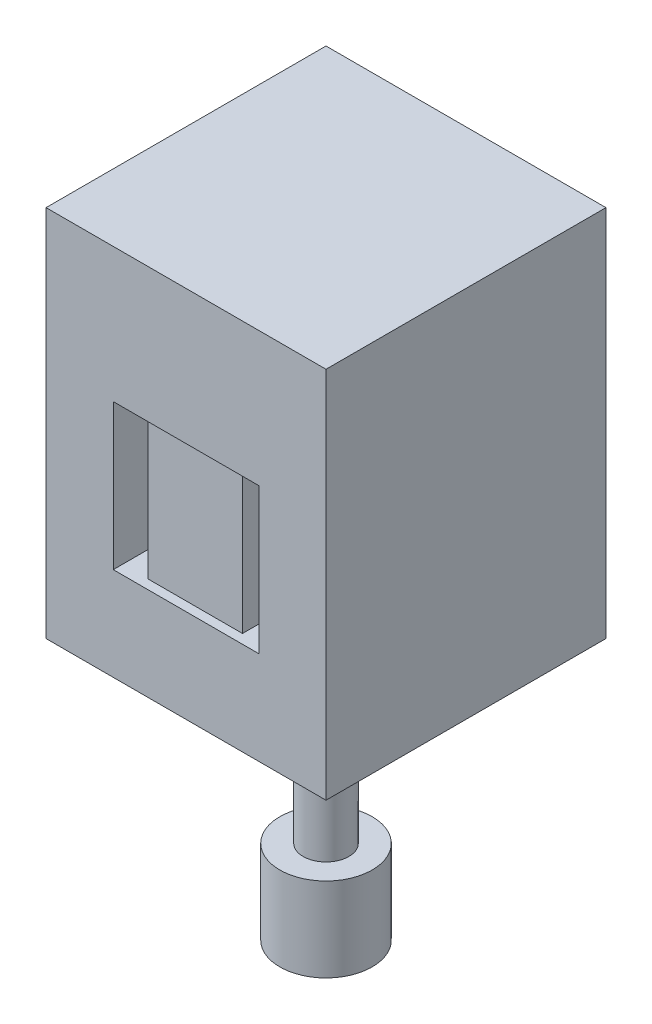
ISO-10303-21;
HEADER;
FILE_DESCRIPTION(('STEP AP214'),'2;1');
FILE_NAME('part.step','',(''),(''),'','','');
FILE_SCHEMA(('AUTOMOTIVE_DESIGN { 1 0 10303 214 1 1 1 1 }'));
ENDSEC;
DATA;
#1=APPLICATION_CONTEXT('core data for automotive mechanical design processes');
#2=APPLICATION_PROTOCOL_DEFINITION('international standard','automotive_design',2000,#1);
#3=PRODUCT_CONTEXT('',#1,'mechanical');
#4=PRODUCT('Part','Part','',(#3));
#5=PRODUCT_RELATED_PRODUCT_CATEGORY('part','',(#4));
#6=PRODUCT_DEFINITION_FORMATION('','',#4);
#7=PRODUCT_DEFINITION_CONTEXT('part definition',#1,'design');
#8=PRODUCT_DEFINITION('design','',#6,#7);
#9=PRODUCT_DEFINITION_SHAPE('','',#8);
#10=(LENGTH_UNIT() NAMED_UNIT(*) SI_UNIT(.MILLI.,.METRE.));
#11=(NAMED_UNIT(*) PLANE_ANGLE_UNIT() SI_UNIT($,.RADIAN.));
#12=(NAMED_UNIT(*) SI_UNIT($,.STERADIAN.) SOLID_ANGLE_UNIT());
#13=UNCERTAINTY_MEASURE_WITH_UNIT(LENGTH_MEASURE(1.E-05),#10,'distance_accuracy_value','');
#14=(GEOMETRIC_REPRESENTATION_CONTEXT(3) GLOBAL_UNCERTAINTY_ASSIGNED_CONTEXT((#13)) GLOBAL_UNIT_ASSIGNED_CONTEXT((#10,
#11,#12)) REPRESENTATION_CONTEXT('',''));
#15=CARTESIAN_POINT('',(0.,0.,0.));
#16=DIRECTION('',(0.,0.,1.));
#17=DIRECTION('',(1.,0.,0.));
#18=AXIS2_PLACEMENT_3D('',#15,#16,#17);
#19=CARTESIAN_POINT('',(0.,0.,14.));
#20=DIRECTION('',(0.,0.,-1.));
#21=DIRECTION('',(-1.,0.,0.));
#22=AXIS2_PLACEMENT_3D('',#19,#20,#21);
#23=PLANE('',#22);
#24=DIRECTION('',(0.,1.,0.));
#25=VECTOR('',#24,1.);
#26=CARTESIAN_POINT('',(-5.05,25.6,14.));
#27=LINE('',#26,#25);
#28=CARTESIAN_POINT('',(-5.05,10.,14.));
#29=VERTEX_POINT('',#28);
#30=CARTESIAN_POINT('',(-5.05,25.6,14.));
#31=VERTEX_POINT('',#30);
#32=EDGE_CURVE('E165',#29,#31,#27,.T.);
#33=ORIENTED_EDGE('',*,*,#32,.F.);
#34=DIRECTION('',(1.,0.,0.));
#35=VECTOR('',#34,1.);
#36=CARTESIAN_POINT('',(-7.8,10.,14.));
#37=LINE('',#36,#35);
#38=CARTESIAN_POINT('',(5.05,10.,14.));
#39=VERTEX_POINT('',#38);
#40=EDGE_CURVE('E208',#29,#39,#37,.T.);
#41=ORIENTED_EDGE('',*,*,#40,.T.);
#42=DIRECTION('',(0.,-1.,0.));
#43=VECTOR('',#42,1.);
#44=CARTESIAN_POINT('',(5.05,25.6,14.));
#45=LINE('',#44,#43);
#46=CARTESIAN_POINT('',(5.05,25.6,14.));
#47=VERTEX_POINT('',#46);
#48=EDGE_CURVE('E168',#47,#39,#45,.T.);
#49=ORIENTED_EDGE('',*,*,#48,.F.);
#50=DIRECTION('',(-1.,0.,0.));
#51=VECTOR('',#50,1.);
#52=CARTESIAN_POINT('',(-7.8,25.6,14.));
#53=LINE('',#52,#51);
#54=EDGE_CURVE('E204',#47,#31,#53,.T.);
#55=ORIENTED_EDGE('',*,*,#54,.T.);
#56=EDGE_LOOP('',(#33,#41,#49,#55));
#57=FACE_BOUND('',#56,.T.);
#58=ADVANCED_FACE('F45',(#57),#23,.F.);
#59=CARTESIAN_POINT('',(15.,40.,15.));
#60=DIRECTION('',(-1.,0.,0.));
#61=DIRECTION('',(0.,0.,1.));
#62=AXIS2_PLACEMENT_3D('',#59,#60,#61);
#63=PLANE('',#62);
#64=DIRECTION('',(0.,0.,-1.));
#65=VECTOR('',#64,1.);
#66=CARTESIAN_POINT('',(15.,0.,15.));
#67=LINE('',#66,#65);
#68=CARTESIAN_POINT('',(15.,0.,15.));
#69=VERTEX_POINT('',#68);
#70=CARTESIAN_POINT('',(15.,0.,-15.));
#71=VERTEX_POINT('',#70);
#72=EDGE_CURVE('E243',#69,#71,#67,.T.);
#73=ORIENTED_EDGE('',*,*,#72,.T.);
#74=DIRECTION('',(0.,-1.,0.));
#75=VECTOR('',#74,1.);
#76=CARTESIAN_POINT('',(15.,40.,-15.));
#77=LINE('',#76,#75);
#78=CARTESIAN_POINT('',(15.,40.,-15.));
#79=VERTEX_POINT('',#78);
#80=EDGE_CURVE('E281',#79,#71,#77,.T.);
#81=ORIENTED_EDGE('',*,*,#80,.F.);
#82=DIRECTION('',(0.,0.,-1.));
#83=VECTOR('',#82,1.);
#84=CARTESIAN_POINT('',(15.,40.,15.));
#85=LINE('',#84,#83);
#86=CARTESIAN_POINT('',(15.,40.,15.));
#87=VERTEX_POINT('',#86);
#88=EDGE_CURVE('E244',#87,#79,#85,.T.);
#89=ORIENTED_EDGE('',*,*,#88,.F.);
#90=DIRECTION('',(0.,-1.,0.));
#91=VECTOR('',#90,1.);
#92=CARTESIAN_POINT('',(15.,40.,15.));
#93=LINE('',#92,#91);
#94=EDGE_CURVE('E258',#87,#69,#93,.T.);
#95=ORIENTED_EDGE('',*,*,#94,.T.);
#96=EDGE_LOOP('',(#73,#81,#89,#95));
#97=FACE_BOUND('',#96,.T.);
#98=ADVANCED_FACE('F301',(#97),#63,.F.);
#99=CARTESIAN_POINT('',(-15.,40.,-15.));
#100=DIRECTION('',(0.,0.,1.));
#101=DIRECTION('',(1.,0.,0.));
#102=AXIS2_PLACEMENT_3D('',#99,#100,#101);
#103=PLANE('',#102);
#104=DIRECTION('',(-1.,0.,0.));
#105=VECTOR('',#104,1.);
#106=CARTESIAN_POINT('',(-15.,0.,-15.));
#107=LINE('',#106,#105);
#108=CARTESIAN_POINT('',(-15.,0.,-15.));
#109=VERTEX_POINT('',#108);
#110=EDGE_CURVE('E262',#71,#109,#107,.T.);
#111=ORIENTED_EDGE('',*,*,#110,.T.);
#112=DIRECTION('',(0.,-1.,0.));
#113=VECTOR('',#112,1.);
#114=CARTESIAN_POINT('',(-15.,40.,-15.));
#115=LINE('',#114,#113);
#116=CARTESIAN_POINT('',(-15.,40.,-15.));
#117=VERTEX_POINT('',#116);
#118=EDGE_CURVE('E277',#117,#109,#115,.T.);
#119=ORIENTED_EDGE('',*,*,#118,.F.);
#120=DIRECTION('',(-1.,0.,0.));
#121=VECTOR('',#120,1.);
#122=CARTESIAN_POINT('',(-15.,40.,-15.));
#123=LINE('',#122,#121);
#124=EDGE_CURVE('E248',#79,#117,#123,.T.);
#125=ORIENTED_EDGE('',*,*,#124,.F.);
#126=ORIENTED_EDGE('',*,*,#80,.T.);
#127=EDGE_LOOP('',(#111,#119,#125,#126));
#128=FACE_BOUND('',#127,.T.);
#129=ADVANCED_FACE('F309',(#128),#103,.F.);
#130=CARTESIAN_POINT('',(-15.,40.,15.));
#131=DIRECTION('',(1.,0.,0.));
#132=DIRECTION('',(0.,0.,-1.));
#133=AXIS2_PLACEMENT_3D('',#130,#131,#132);
#134=PLANE('',#133);
#135=DIRECTION('',(0.,0.,1.));
#136=VECTOR('',#135,1.);
#137=CARTESIAN_POINT('',(-15.,0.,15.));
#138=LINE('',#137,#136);
#139=CARTESIAN_POINT('',(-15.,0.,15.));
#140=VERTEX_POINT('',#139);
#141=EDGE_CURVE('E265',#109,#140,#138,.T.);
#142=ORIENTED_EDGE('',*,*,#141,.T.);
#143=DIRECTION('',(0.,-1.,0.));
#144=VECTOR('',#143,1.);
#145=CARTESIAN_POINT('',(-15.,40.,15.));
#146=LINE('',#145,#144);
#147=CARTESIAN_POINT('',(-15.,40.,15.));
#148=VERTEX_POINT('',#147);
#149=EDGE_CURVE('E273',#148,#140,#146,.T.);
#150=ORIENTED_EDGE('',*,*,#149,.F.);
#151=DIRECTION('',(0.,0.,1.));
#152=VECTOR('',#151,1.);
#153=CARTESIAN_POINT('',(-15.,40.,15.));
#154=LINE('',#153,#152);
#155=EDGE_CURVE('E252',#117,#148,#154,.T.);
#156=ORIENTED_EDGE('',*,*,#155,.F.);
#157=ORIENTED_EDGE('',*,*,#118,.T.);
#158=EDGE_LOOP('',(#142,#150,#156,#157));
#159=FACE_BOUND('',#158,.T.);
#160=ADVANCED_FACE('F350',(#159),#134,.F.);
#161=CARTESIAN_POINT('',(-15.,40.,15.));
#162=DIRECTION('',(0.,0.,-1.));
#163=DIRECTION('',(-1.,0.,0.));
#164=AXIS2_PLACEMENT_3D('',#161,#162,#163);
#165=PLANE('',#164);
#166=DIRECTION('',(-1.,0.,0.));
#167=VECTOR('',#166,1.);
#168=CARTESIAN_POINT('',(-7.8,25.6,15.));
#169=LINE('',#168,#167);
#170=CARTESIAN_POINT('',(7.79999999999999,25.6,15.));
#171=VERTEX_POINT('',#170);
#172=CARTESIAN_POINT('',(-7.8,25.6,15.));
#173=VERTEX_POINT('',#172);
#174=EDGE_CURVE('E216',#171,#173,#169,.T.);
#175=ORIENTED_EDGE('',*,*,#174,.F.);
#176=DIRECTION('',(0.,1.,0.));
#177=VECTOR('',#176,1.);
#178=CARTESIAN_POINT('',(7.79999999999999,10.,15.));
#179=LINE('',#178,#177);
#180=CARTESIAN_POINT('',(7.79999999999999,10.,15.));
#181=VERTEX_POINT('',#180);
#182=EDGE_CURVE('E178',#181,#171,#179,.T.);
#183=ORIENTED_EDGE('',*,*,#182,.F.);
#184=DIRECTION('',(1.,0.,0.));
#185=VECTOR('',#184,1.);
#186=CARTESIAN_POINT('',(-7.8,10.,15.));
#187=LINE('',#186,#185);
#188=CARTESIAN_POINT('',(-7.8,10.,15.));
#189=VERTEX_POINT('',#188);
#190=EDGE_CURVE('E209',#189,#181,#187,.T.);
#191=ORIENTED_EDGE('',*,*,#190,.F.);
#192=DIRECTION('',(0.,-1.,0.));
#193=VECTOR('',#192,1.);
#194=CARTESIAN_POINT('',(-7.8,10.,15.));
#195=LINE('',#194,#193);
#196=EDGE_CURVE('E144',#173,#189,#195,.T.);
#197=ORIENTED_EDGE('',*,*,#196,.F.);
#198=EDGE_LOOP('',(#175,#183,#191,#197));
#199=FACE_BOUND('',#198,.T.);
#200=DIRECTION('',(1.,0.,0.));
#201=VECTOR('',#200,1.);
#202=CARTESIAN_POINT('',(-15.,0.,15.));
#203=LINE('',#202,#201);
#204=EDGE_CURVE('E249',#140,#69,#203,.T.);
#205=ORIENTED_EDGE('',*,*,#204,.T.);
#206=ORIENTED_EDGE('',*,*,#94,.F.);
#207=DIRECTION('',(1.,0.,0.));
#208=VECTOR('',#207,1.);
#209=CARTESIAN_POINT('',(-15.,40.,15.));
#210=LINE('',#209,#208);
#211=EDGE_CURVE('E255',#148,#87,#210,.T.);
#212=ORIENTED_EDGE('',*,*,#211,.F.);
#213=ORIENTED_EDGE('',*,*,#149,.T.);
#214=EDGE_LOOP('',(#205,#206,#212,#213));
#215=FACE_BOUND('',#214,.T.);
#216=ADVANCED_FACE('F344',(#199,#215),#165,.F.);
#217=CARTESIAN_POINT('',(0.,40.,0.));
#218=DIRECTION('',(0.,-1.,0.));
#219=DIRECTION('',(0.,0.,-1.));
#220=AXIS2_PLACEMENT_3D('',#217,#218,#219);
#221=PLANE('',#220);
#222=ORIENTED_EDGE('',*,*,#88,.T.);
#223=ORIENTED_EDGE('',*,*,#124,.T.);
#224=ORIENTED_EDGE('',*,*,#155,.T.);
#225=ORIENTED_EDGE('',*,*,#211,.T.);
#226=EDGE_LOOP('',(#222,#223,#224,#225));
#227=FACE_BOUND('',#226,.T.);
#228=ADVANCED_FACE('F341',(#227),#221,.F.);
#229=CARTESIAN_POINT('',(0.,0.,0.));
#230=DIRECTION('',(0.,-1.,0.));
#231=DIRECTION('',(0.,0.,-1.));
#232=AXIS2_PLACEMENT_3D('',#229,#230,#231);
#233=PLANE('',#232);
#234=CARTESIAN_POINT('',(0.,0.,0.));
#235=DIRECTION('',(0.,-1.,0.));
#236=DIRECTION('',(0.,0.,-1.));
#237=AXIS2_PLACEMENT_3D('',#234,#235,#236);
#238=CIRCLE('',#237,5.45);
#239=CARTESIAN_POINT('',(0.,0.,-5.45));
#240=VERTEX_POINT('',#239);
#241=EDGE_CURVE('E11',#240,#240,#238,.F.);
#242=ORIENTED_EDGE('',*,*,#241,.T.);
#243=EDGE_LOOP('',(#242));
#244=FACE_BOUND('',#243,.T.);
#245=ORIENTED_EDGE('',*,*,#72,.F.);
#246=ORIENTED_EDGE('',*,*,#204,.F.);
#247=ORIENTED_EDGE('',*,*,#141,.F.);
#248=ORIENTED_EDGE('',*,*,#110,.F.);
#249=EDGE_LOOP('',(#245,#246,#247,#248));
#250=FACE_BOUND('',#249,.T.);
#251=ADVANCED_FACE('F340',(#244,#250),#233,.T.);
#252=CARTESIAN_POINT('',(0.,-19.,0.));
#253=DIRECTION('',(0.,1.,0.));
#254=DIRECTION('',(0.,0.,1.));
#255=AXIS2_PLACEMENT_3D('',#252,#253,#254);
#256=CYLINDRICAL_SURFACE('',#255,2.45);
#257=CARTESIAN_POINT('',(0.,-3.,0.));
#258=DIRECTION('',(0.,-1.,0.));
#259=DIRECTION('',(0.,0.,-1.));
#260=AXIS2_PLACEMENT_3D('',#257,#258,#259);
#261=CIRCLE('',#260,2.45);
#262=CARTESIAN_POINT('',(0.,-3.,-2.45));
#263=VERTEX_POINT('',#262);
#264=EDGE_CURVE('E54',#263,#263,#261,.T.);
#265=ORIENTED_EDGE('',*,*,#264,.T.);
#266=EDGE_LOOP('',(#265));
#267=FACE_BOUND('',#266,.T.);
#268=CARTESIAN_POINT('',(0.,-19.,0.));
#269=DIRECTION('',(0.,-1.,0.));
#270=DIRECTION('',(0.,0.,-1.));
#271=AXIS2_PLACEMENT_3D('',#268,#269,#270);
#272=CIRCLE('',#271,2.45);
#273=CARTESIAN_POINT('',(0.,-19.,-2.45));
#274=VERTEX_POINT('',#273);
#275=EDGE_CURVE('E236',#274,#274,#272,.T.);
#276=ORIENTED_EDGE('',*,*,#275,.F.);
#277=EDGE_LOOP('',(#276));
#278=FACE_BOUND('',#277,.T.);
#279=ADVANCED_FACE('F288',(#267,#278),#256,.T.);
#280=CARTESIAN_POINT('',(0.,-28.,0.));
#281=DIRECTION('',(0.,1.,0.));
#282=DIRECTION('',(0.,0.,1.));
#283=AXIS2_PLACEMENT_3D('',#280,#281,#282);
#284=CYLINDRICAL_SURFACE('',#283,4.95);
#285=CARTESIAN_POINT('',(0.,-28.,0.));
#286=DIRECTION('',(0.,-1.,0.));
#287=DIRECTION('',(0.,0.,-1.));
#288=AXIS2_PLACEMENT_3D('',#285,#286,#287);
#289=CIRCLE('',#288,4.95);
#290=CARTESIAN_POINT('',(0.,-28.,-4.95));
#291=VERTEX_POINT('',#290);
#292=EDGE_CURVE('E232',#291,#291,#289,.T.);
#293=ORIENTED_EDGE('',*,*,#292,.F.);
#294=EDGE_LOOP('',(#293));
#295=FACE_BOUND('',#294,.T.);
#296=CARTESIAN_POINT('',(0.,-19.,0.));
#297=DIRECTION('',(0.,-1.,0.));
#298=DIRECTION('',(0.,0.,-1.));
#299=AXIS2_PLACEMENT_3D('',#296,#297,#298);
#300=CIRCLE('',#299,4.95);
#301=CARTESIAN_POINT('',(0.,-19.,-4.95));
#302=VERTEX_POINT('',#301);
#303=EDGE_CURVE('E225',#302,#302,#300,.T.);
#304=ORIENTED_EDGE('',*,*,#303,.T.);
#305=EDGE_LOOP('',(#304));
#306=FACE_BOUND('',#305,.T.);
#307=ADVANCED_FACE('F331',(#295,#306),#284,.T.);
#308=CARTESIAN_POINT('',(0.,-28.,0.));
#309=DIRECTION('',(0.,-1.,0.));
#310=DIRECTION('',(0.,0.,-1.));
#311=AXIS2_PLACEMENT_3D('',#308,#309,#310);
#312=PLANE('',#311);
#313=ORIENTED_EDGE('',*,*,#292,.T.);
#314=EDGE_LOOP('',(#313));
#315=FACE_BOUND('',#314,.T.);
#316=ADVANCED_FACE('F328',(#315),#312,.T.);
#317=CARTESIAN_POINT('',(0.,-19.,0.));
#318=DIRECTION('',(0.,-1.,0.));
#319=DIRECTION('',(0.,0.,-1.));
#320=AXIS2_PLACEMENT_3D('',#317,#318,#319);
#321=PLANE('',#320);
#322=ORIENTED_EDGE('',*,*,#275,.T.);
#323=EDGE_LOOP('',(#322));
#324=FACE_BOUND('',#323,.T.);
#325=ORIENTED_EDGE('',*,*,#303,.F.);
#326=EDGE_LOOP('',(#325));
#327=FACE_BOUND('',#326,.T.);
#328=ADVANCED_FACE('F326',(#324,#327),#321,.F.);
#329=CARTESIAN_POINT('',(7.79999999999999,10.,14.));
#330=DIRECTION('',(1.,0.,0.));
#331=DIRECTION('',(0.,1.,0.));
#332=AXIS2_PLACEMENT_3D('',#329,#330,#331);
#333=PLANE('',#332);
#334=ORIENTED_EDGE('',*,*,#182,.T.);
#335=DIRECTION('',(0.,0.,1.));
#336=VECTOR('',#335,1.);
#337=CARTESIAN_POINT('',(7.8,25.6,14.));
#338=LINE('',#337,#336);
#339=CARTESIAN_POINT('',(7.79999999999999,25.6,11.));
#340=VERTEX_POINT('',#339);
#341=EDGE_CURVE('E213',#340,#171,#338,.T.);
#342=ORIENTED_EDGE('',*,*,#341,.F.);
#343=DIRECTION('',(0.,1.,0.));
#344=VECTOR('',#343,1.);
#345=CARTESIAN_POINT('',(7.79999999999999,25.6,11.));
#346=LINE('',#345,#344);
#347=CARTESIAN_POINT('',(7.79999999999999,10.,11.));
#348=VERTEX_POINT('',#347);
#349=EDGE_CURVE('E189',#348,#340,#346,.T.);
#350=ORIENTED_EDGE('',*,*,#349,.F.);
#351=DIRECTION('',(0.,0.,1.));
#352=VECTOR('',#351,1.);
#353=CARTESIAN_POINT('',(7.79999999999999,10.,14.));
#354=LINE('',#353,#352);
#355=EDGE_CURVE('E149',#348,#181,#354,.T.);
#356=ORIENTED_EDGE('',*,*,#355,.T.);
#357=EDGE_LOOP('',(#334,#342,#350,#356));
#358=FACE_BOUND('',#357,.T.);
#359=ADVANCED_FACE('F317',(#358),#333,.F.);
#360=CARTESIAN_POINT('',(-7.8,10.,14.));
#361=DIRECTION('',(0.,-1.,0.));
#362=DIRECTION('',(0.,0.,-1.));
#363=AXIS2_PLACEMENT_3D('',#360,#361,#362);
#364=PLANE('',#363);
#365=ORIENTED_EDGE('',*,*,#190,.T.);
#366=ORIENTED_EDGE('',*,*,#355,.F.);
#367=DIRECTION('',(1.,0.,0.));
#368=VECTOR('',#367,1.);
#369=CARTESIAN_POINT('',(7.79999999999999,10.,11.));
#370=LINE('',#369,#368);
#371=CARTESIAN_POINT('',(5.05,10.,11.));
#372=VERTEX_POINT('',#371);
#373=EDGE_CURVE('E183',#372,#348,#370,.T.);
#374=ORIENTED_EDGE('',*,*,#373,.F.);
#375=DIRECTION('',(0.,0.,1.));
#376=VECTOR('',#375,1.);
#377=CARTESIAN_POINT('',(5.05,10.,11.));
#378=LINE('',#377,#376);
#379=EDGE_CURVE('E184',#372,#39,#378,.T.);
#380=ORIENTED_EDGE('',*,*,#379,.T.);
#381=ORIENTED_EDGE('',*,*,#40,.F.);
#382=DIRECTION('',(0.,0.,1.));
#383=VECTOR('',#382,1.);
#384=CARTESIAN_POINT('',(-5.05,10.,11.));
#385=LINE('',#384,#383);
#386=CARTESIAN_POINT('',(-5.05,10.,11.));
#387=VERTEX_POINT('',#386);
#388=EDGE_CURVE('E61',#387,#29,#385,.T.);
#389=ORIENTED_EDGE('',*,*,#388,.F.);
#390=DIRECTION('',(1.,0.,0.));
#391=VECTOR('',#390,1.);
#392=CARTESIAN_POINT('',(-7.8,10.,11.));
#393=LINE('',#392,#391);
#394=CARTESIAN_POINT('',(-7.8,10.,11.));
#395=VERTEX_POINT('',#394);
#396=EDGE_CURVE('E153',#395,#387,#393,.T.);
#397=ORIENTED_EDGE('',*,*,#396,.F.);
#398=DIRECTION('',(0.,0.,1.));
#399=VECTOR('',#398,1.);
#400=CARTESIAN_POINT('',(-7.8,10.,14.));
#401=LINE('',#400,#399);
#402=EDGE_CURVE('E137',#395,#189,#401,.T.);
#403=ORIENTED_EDGE('',*,*,#402,.T.);
#404=EDGE_LOOP('',(#365,#366,#374,#380,#381,#389,#397,#403));
#405=FACE_BOUND('',#404,.T.);
#406=ADVANCED_FACE('F154',(#405),#364,.F.);
#407=CARTESIAN_POINT('',(-7.8,10.,14.));
#408=DIRECTION('',(-1.,0.,0.));
#409=DIRECTION('',(0.,0.,1.));
#410=AXIS2_PLACEMENT_3D('',#407,#408,#409);
#411=PLANE('',#410);
#412=ORIENTED_EDGE('',*,*,#196,.T.);
#413=ORIENTED_EDGE('',*,*,#402,.F.);
#414=DIRECTION('',(0.,-1.,0.));
#415=VECTOR('',#414,1.);
#416=CARTESIAN_POINT('',(-7.8,25.6,11.));
#417=LINE('',#416,#415);
#418=CARTESIAN_POINT('',(-7.8,25.6,11.));
#419=VERTEX_POINT('',#418);
#420=EDGE_CURVE('E141',#419,#395,#417,.T.);
#421=ORIENTED_EDGE('',*,*,#420,.F.);
#422=DIRECTION('',(0.,0.,1.));
#423=VECTOR('',#422,1.);
#424=CARTESIAN_POINT('',(-7.8,25.6,14.));
#425=LINE('',#424,#423);
#426=EDGE_CURVE('E150',#419,#173,#425,.T.);
#427=ORIENTED_EDGE('',*,*,#426,.T.);
#428=EDGE_LOOP('',(#412,#413,#421,#427));
#429=FACE_BOUND('',#428,.T.);
#430=ADVANCED_FACE('F139',(#429),#411,.F.);
#431=CARTESIAN_POINT('',(-7.8,25.6,14.));
#432=DIRECTION('',(0.,1.,0.));
#433=DIRECTION('',(0.,0.,1.));
#434=AXIS2_PLACEMENT_3D('',#431,#432,#433);
#435=PLANE('',#434);
#436=ORIENTED_EDGE('',*,*,#174,.T.);
#437=ORIENTED_EDGE('',*,*,#426,.F.);
#438=DIRECTION('',(-1.,0.,0.));
#439=VECTOR('',#438,1.);
#440=CARTESIAN_POINT('',(-7.8,25.6,11.));
#441=LINE('',#440,#439);
#442=CARTESIAN_POINT('',(-5.05,25.6,11.));
#443=VERTEX_POINT('',#442);
#444=EDGE_CURVE('E163',#443,#419,#441,.T.);
#445=ORIENTED_EDGE('',*,*,#444,.F.);
#446=DIRECTION('',(0.,0.,1.));
#447=VECTOR('',#446,1.);
#448=CARTESIAN_POINT('',(-5.05,25.6,11.));
#449=LINE('',#448,#447);
#450=EDGE_CURVE('E175',#443,#31,#449,.T.);
#451=ORIENTED_EDGE('',*,*,#450,.T.);
#452=ORIENTED_EDGE('',*,*,#54,.F.);
#453=DIRECTION('',(0.,0.,1.));
#454=VECTOR('',#453,1.);
#455=CARTESIAN_POINT('',(5.05,25.6,11.));
#456=LINE('',#455,#454);
#457=CARTESIAN_POINT('',(5.05,25.6,11.));
#458=VERTEX_POINT('',#457);
#459=EDGE_CURVE('E69',#458,#47,#456,.T.);
#460=ORIENTED_EDGE('',*,*,#459,.F.);
#461=DIRECTION('',(-1.,0.,0.));
#462=VECTOR('',#461,1.);
#463=CARTESIAN_POINT('',(7.79999999999999,25.6,11.));
#464=LINE('',#463,#462);
#465=EDGE_CURVE('E197',#340,#458,#464,.T.);
#466=ORIENTED_EDGE('',*,*,#465,.F.);
#467=ORIENTED_EDGE('',*,*,#341,.T.);
#468=EDGE_LOOP('',(#436,#437,#445,#451,#452,#460,#466,#467));
#469=FACE_BOUND('',#468,.T.);
#470=ADVANCED_FACE('F320',(#469),#435,.F.);
#471=CARTESIAN_POINT('',(5.05,25.6,11.));
#472=DIRECTION('',(-1.,0.,0.));
#473=DIRECTION('',(0.,-1.,0.));
#474=AXIS2_PLACEMENT_3D('',#471,#472,#473);
#475=PLANE('',#474);
#476=ORIENTED_EDGE('',*,*,#48,.T.);
#477=ORIENTED_EDGE('',*,*,#379,.F.);
#478=DIRECTION('',(0.,-1.,0.));
#479=VECTOR('',#478,1.);
#480=CARTESIAN_POINT('',(5.05,25.6,11.));
#481=LINE('',#480,#479);
#482=EDGE_CURVE('E193',#458,#372,#481,.T.);
#483=ORIENTED_EDGE('',*,*,#482,.F.);
#484=ORIENTED_EDGE('',*,*,#459,.T.);
#485=EDGE_LOOP('',(#476,#477,#483,#484));
#486=FACE_BOUND('',#485,.T.);
#487=ADVANCED_FACE('F323',(#486),#475,.F.);
#488=CARTESIAN_POINT('',(0.,0.,11.));
#489=DIRECTION('',(0.,0.,-1.));
#490=DIRECTION('',(-1.,0.,0.));
#491=AXIS2_PLACEMENT_3D('',#488,#489,#490);
#492=PLANE('',#491);
#493=ORIENTED_EDGE('',*,*,#349,.T.);
#494=ORIENTED_EDGE('',*,*,#465,.T.);
#495=ORIENTED_EDGE('',*,*,#482,.T.);
#496=ORIENTED_EDGE('',*,*,#373,.T.);
#497=EDGE_LOOP('',(#493,#494,#495,#496));
#498=FACE_BOUND('',#497,.T.);
#499=ADVANCED_FACE('F313',(#498),#492,.F.);
#500=CARTESIAN_POINT('',(-5.05,25.6,11.));
#501=DIRECTION('',(1.,0.,0.));
#502=DIRECTION('',(0.,0.,-1.));
#503=AXIS2_PLACEMENT_3D('',#500,#501,#502);
#504=PLANE('',#503);
#505=ORIENTED_EDGE('',*,*,#32,.T.);
#506=ORIENTED_EDGE('',*,*,#450,.F.);
#507=DIRECTION('',(0.,1.,0.));
#508=VECTOR('',#507,1.);
#509=CARTESIAN_POINT('',(-5.05,25.6,11.));
#510=LINE('',#509,#508);
#511=EDGE_CURVE('E159',#387,#443,#510,.T.);
#512=ORIENTED_EDGE('',*,*,#511,.F.);
#513=ORIENTED_EDGE('',*,*,#388,.T.);
#514=EDGE_LOOP('',(#505,#506,#512,#513));
#515=FACE_BOUND('',#514,.T.);
#516=ADVANCED_FACE('F297',(#515),#504,.F.);
#517=CARTESIAN_POINT('',(0.,0.,11.));
#518=DIRECTION('',(0.,0.,1.));
#519=DIRECTION('',(1.,0.,0.));
#520=AXIS2_PLACEMENT_3D('',#517,#518,#519);
#521=PLANE('',#520);
#522=ORIENTED_EDGE('',*,*,#420,.T.);
#523=ORIENTED_EDGE('',*,*,#396,.T.);
#524=ORIENTED_EDGE('',*,*,#511,.T.);
#525=ORIENTED_EDGE('',*,*,#444,.T.);
#526=EDGE_LOOP('',(#522,#523,#524,#525));
#527=FACE_BOUND('',#526,.T.);
#528=ADVANCED_FACE('F161',(#527),#521,.T.);
#529=CARTESIAN_POINT('',(0.,-3.,0.));
#530=DIRECTION('',(0.,-1.,0.));
#531=DIRECTION('',(0.,0.,-1.));
#532=AXIS2_PLACEMENT_3D('',#529,#530,#531);
#533=TOROIDAL_SURFACE('',#532,5.45,3.);
#534=ORIENTED_EDGE('',*,*,#241,.F.);
#535=EDGE_LOOP('',(#534));
#536=FACE_BOUND('',#535,.T.);
#537=ORIENTED_EDGE('',*,*,#264,.F.);
#538=EDGE_LOOP('',(#537));
#539=FACE_BOUND('',#538,.T.);
#540=ADVANCED_FACE('F47',(#536,#539),#533,.F.);
#541=CLOSED_SHELL('',(#58,#98,#129,#160,#216,#228,#251,#279,#307,#316,#328,#359,#406,#430,#470,
#487,#499,#516,#528,#540));
#542=MANIFOLD_SOLID_BREP('B2',#541);
#543=ADVANCED_BREP_SHAPE_REPRESENTATION('',(#18,#542),#14);
#544=SHAPE_DEFINITION_REPRESENTATION(#9,#543);
ENDSEC;
END-ISO-10303-21;
